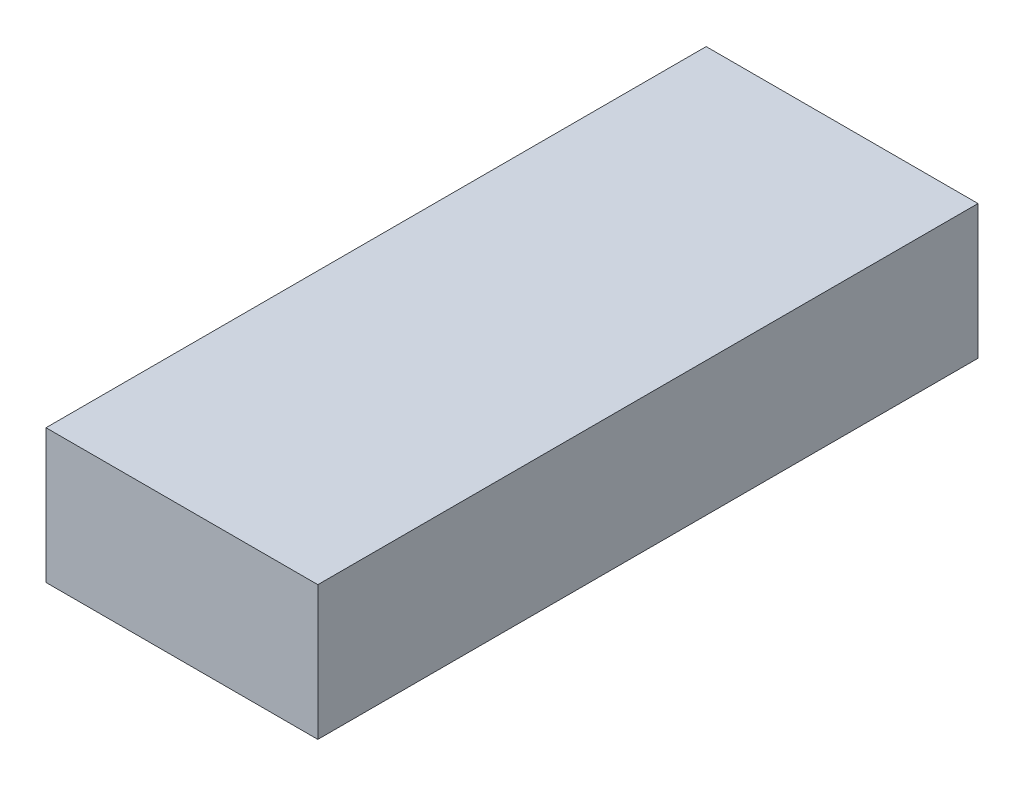
ISO-10303-21;
HEADER;
FILE_DESCRIPTION(('STEP AP214'),'2;1');
FILE_NAME('part.step','',(''),(''),'','','');
FILE_SCHEMA(('AUTOMOTIVE_DESIGN { 1 0 10303 214 1 1 1 1 }'));
ENDSEC;
DATA;
#1=APPLICATION_CONTEXT('core data for automotive mechanical design processes');
#2=APPLICATION_PROTOCOL_DEFINITION('international standard','automotive_design',2000,#1);
#3=PRODUCT_CONTEXT('',#1,'mechanical');
#4=PRODUCT('Part','Part','',(#3));
#5=PRODUCT_RELATED_PRODUCT_CATEGORY('part','',(#4));
#6=PRODUCT_DEFINITION_FORMATION('','',#4);
#7=PRODUCT_DEFINITION_CONTEXT('part definition',#1,'design');
#8=PRODUCT_DEFINITION('design','',#6,#7);
#9=PRODUCT_DEFINITION_SHAPE('','',#8);
#10=(LENGTH_UNIT() NAMED_UNIT(*) SI_UNIT(.MILLI.,.METRE.));
#11=(NAMED_UNIT(*) PLANE_ANGLE_UNIT() SI_UNIT($,.RADIAN.));
#12=(NAMED_UNIT(*) SI_UNIT($,.STERADIAN.) SOLID_ANGLE_UNIT());
#13=UNCERTAINTY_MEASURE_WITH_UNIT(LENGTH_MEASURE(1.E-05),#10,'distance_accuracy_value','');
#14=(GEOMETRIC_REPRESENTATION_CONTEXT(3) GLOBAL_UNCERTAINTY_ASSIGNED_CONTEXT((#13)) GLOBAL_UNIT_ASSIGNED_CONTEXT((#10,
#11,#12)) REPRESENTATION_CONTEXT('',''));
#15=CARTESIAN_POINT('',(0.,0.,0.));
#16=DIRECTION('',(0.,0.,1.));
#17=DIRECTION('',(1.,0.,0.));
#18=AXIS2_PLACEMENT_3D('',#15,#16,#17);
#19=CARTESIAN_POINT('',(-15.2,-15.4,-23.2));
#20=DIRECTION('',(0.,-1.,0.));
#21=DIRECTION('',(0.,0.,-1.));
#22=AXIS2_PLACEMENT_3D('',#19,#20,#21);
#23=PLANE('',#22);
#24=CARTESIAN_POINT('',(-15.2,-15.4,-23.2));
#25=DIRECTION('',(0.,-1.,0.));
#26=DIRECTION('',(0.,0.,-1.));
#27=AXIS2_PLACEMENT_3D('',#24,#25,#26);
#28=CIRCLE('',#27,5.);
#29=CARTESIAN_POINT('',(-19.7,-15.4,-21.0205505282297));
#30=VERTEX_POINT('',#29);
#31=CARTESIAN_POINT('',(-19.7,-15.4,-25.3794494717704));
#32=VERTEX_POINT('',#31);
#33=EDGE_CURVE('E281',#30,#32,#28,.T.);
#34=ORIENTED_EDGE('',*,*,#33,.F.);
#35=DIRECTION('',(0.,0.,-1.));
#36=VECTOR('',#35,1.);
#37=CARTESIAN_POINT('',(-19.7,-15.4,-101.2));
#38=LINE('',#37,#36);
#39=EDGE_CURVE('E439',#30,#32,#38,.T.);
#40=ORIENTED_EDGE('',*,*,#39,.T.);
#41=EDGE_LOOP('',(#34,#40));
#42=FACE_BOUND('',#41,.T.);
#43=ADVANCED_FACE('F35',(#42),#23,.F.);
#44=CARTESIAN_POINT('',(15.2,-15.4,-23.2));
#45=DIRECTION('',(0.,-1.,0.));
#46=DIRECTION('',(0.,0.,-1.));
#47=AXIS2_PLACEMENT_3D('',#44,#45,#46);
#48=PLANE('',#47);
#49=CARTESIAN_POINT('',(15.2,-15.4,-83.2));
#50=DIRECTION('',(0.,-1.,0.));
#51=DIRECTION('',(0.,0.,-1.));
#52=AXIS2_PLACEMENT_3D('',#49,#50,#51);
#53=CIRCLE('',#52,5.);
#54=CARTESIAN_POINT('',(19.7,-15.4,-85.3794494717703));
#55=VERTEX_POINT('',#54);
#56=CARTESIAN_POINT('',(19.7,-15.4,-81.0205505282297));
#57=VERTEX_POINT('',#56);
#58=EDGE_CURVE('E265',#55,#57,#53,.T.);
#59=ORIENTED_EDGE('',*,*,#58,.F.);
#60=DIRECTION('',(0.,0.,1.));
#61=VECTOR('',#60,1.);
#62=CARTESIAN_POINT('',(19.7,-15.4,2.20000000000001));
#63=LINE('',#62,#61);
#64=EDGE_CURVE('E431',#55,#57,#63,.T.);
#65=ORIENTED_EDGE('',*,*,#64,.T.);
#66=EDGE_LOOP('',(#59,#65));
#67=FACE_BOUND('',#66,.T.);
#68=ADVANCED_FACE('F496',(#67),#48,.F.);
#69=CARTESIAN_POINT('',(19.7,-134.985613127271,-101.2));
#70=DIRECTION('',(-1.,0.,0.));
#71=DIRECTION('',(0.,0.,1.));
#72=AXIS2_PLACEMENT_3D('',#69,#70,#71);
#73=PLANE('',#72);
#74=DIRECTION('',(0.,1.,0.));
#75=VECTOR('',#74,1.);
#76=CARTESIAN_POINT('',(19.7,-134.985613127271,-101.2));
#77=LINE('',#76,#75);
#78=CARTESIAN_POINT('',(19.7,-15.4,-101.2));
#79=VERTEX_POINT('',#78);
#80=CARTESIAN_POINT('',(19.7,-13.,-101.2));
#81=VERTEX_POINT('',#80);
#82=EDGE_CURVE('E239',#79,#81,#77,.T.);
#83=ORIENTED_EDGE('',*,*,#82,.F.);
#84=DIRECTION('',(0.,0.,1.));
#85=VECTOR('',#84,1.);
#86=CARTESIAN_POINT('',(19.7,-15.4,-101.2));
#87=LINE('',#86,#85);
#88=EDGE_CURVE('E250',#79,#55,#87,.T.);
#89=ORIENTED_EDGE('',*,*,#88,.T.);
#90=DIRECTION('',(0.,1.,0.));
#91=VECTOR('',#90,1.);
#92=CARTESIAN_POINT('',(19.7,-15.4,-85.3794494717703));
#93=LINE('',#92,#91);
#94=CARTESIAN_POINT('',(19.7,-13.,-85.3794494717703));
#95=VERTEX_POINT('',#94);
#96=EDGE_CURVE('E413',#55,#95,#93,.T.);
#97=ORIENTED_EDGE('',*,*,#96,.T.);
#98=DIRECTION('',(0.,0.,-1.));
#99=VECTOR('',#98,1.);
#100=CARTESIAN_POINT('',(19.7,-13.,2.20000000000001));
#101=LINE('',#100,#99);
#102=EDGE_CURVE('E346',#95,#81,#101,.T.);
#103=ORIENTED_EDGE('',*,*,#102,.T.);
#104=EDGE_LOOP('',(#83,#89,#97,#103));
#105=FACE_BOUND('',#104,.T.);
#106=ADVANCED_FACE('F453',(#105),#73,.T.);
#107=DIRECTION('',(0.,1.,0.));
#108=VECTOR('',#107,1.);
#109=CARTESIAN_POINT('',(19.7,-15.4,-81.0205505282297));
#110=LINE('',#109,#108);
#111=CARTESIAN_POINT('',(19.7,-13.,-81.0205505282297));
#112=VERTEX_POINT('',#111);
#113=EDGE_CURVE('E416',#112,#57,#110,.F.);
#114=ORIENTED_EDGE('',*,*,#113,.T.);
#115=CARTESIAN_POINT('',(19.7,-15.4,-25.3794494717703));
#116=VERTEX_POINT('',#115);
#117=EDGE_CURVE('E249',#57,#116,#87,.T.);
#118=ORIENTED_EDGE('',*,*,#117,.T.);
#119=DIRECTION('',(0.,1.,0.));
#120=VECTOR('',#119,1.);
#121=CARTESIAN_POINT('',(19.7,-15.4,-25.3794494717703));
#122=LINE('',#121,#120);
#123=CARTESIAN_POINT('',(19.7,-13.,-25.3794494717703));
#124=VERTEX_POINT('',#123);
#125=EDGE_CURVE('E419',#116,#124,#122,.T.);
#126=ORIENTED_EDGE('',*,*,#125,.T.);
#127=EDGE_CURVE('E349',#124,#112,#101,.T.);
#128=ORIENTED_EDGE('',*,*,#127,.T.);
#129=EDGE_LOOP('',(#114,#118,#126,#128));
#130=FACE_BOUND('',#129,.T.);
#131=ADVANCED_FACE('F490',(#130),#73,.T.);
#132=DIRECTION('',(0.,1.,0.));
#133=VECTOR('',#132,1.);
#134=CARTESIAN_POINT('',(19.7,-15.4,-21.0205505282297));
#135=LINE('',#134,#133);
#136=CARTESIAN_POINT('',(19.7,-13.,-21.0205505282297));
#137=VERTEX_POINT('',#136);
#138=CARTESIAN_POINT('',(19.7,-15.4,-21.0205505282297));
#139=VERTEX_POINT('',#138);
#140=EDGE_CURVE('E422',#137,#139,#135,.F.);
#141=ORIENTED_EDGE('',*,*,#140,.T.);
#142=CARTESIAN_POINT('',(19.7,-15.4,2.19999999999998));
#143=VERTEX_POINT('',#142);
#144=EDGE_CURVE('E229',#139,#143,#87,.T.);
#145=ORIENTED_EDGE('',*,*,#144,.T.);
#146=DIRECTION('',(0.,1.,0.));
#147=VECTOR('',#146,1.);
#148=CARTESIAN_POINT('',(19.7,-134.985613127271,2.20000000000001));
#149=LINE('',#148,#147);
#150=CARTESIAN_POINT('',(19.7,-13.,2.20000000000001));
#151=VERTEX_POINT('',#150);
#152=EDGE_CURVE('E300',#143,#151,#149,.T.);
#153=ORIENTED_EDGE('',*,*,#152,.T.);
#154=EDGE_CURVE('E328',#151,#137,#101,.T.);
#155=ORIENTED_EDGE('',*,*,#154,.T.);
#156=EDGE_LOOP('',(#141,#145,#153,#155));
#157=FACE_BOUND('',#156,.T.);
#158=ADVANCED_FACE('F479',(#157),#73,.T.);
#159=CARTESIAN_POINT('',(-19.7,-134.985613127271,2.20000000000001));
#160=DIRECTION('',(1.,0.,0.));
#161=DIRECTION('',(0.,0.,-1.));
#162=AXIS2_PLACEMENT_3D('',#159,#160,#161);
#163=PLANE('',#162);
#164=DIRECTION('',(0.,1.,0.));
#165=VECTOR('',#164,1.);
#166=CARTESIAN_POINT('',(-19.7,-134.985613127271,2.20000000000001));
#167=LINE('',#166,#165);
#168=CARTESIAN_POINT('',(-19.7,-15.4,2.20000000000001));
#169=VERTEX_POINT('',#168);
#170=CARTESIAN_POINT('',(-19.7,-13.,2.20000000000001));
#171=VERTEX_POINT('',#170);
#172=EDGE_CURVE('E299',#169,#171,#167,.T.);
#173=ORIENTED_EDGE('',*,*,#172,.F.);
#174=DIRECTION('',(0.,0.,-1.));
#175=VECTOR('',#174,1.);
#176=CARTESIAN_POINT('',(-19.7,-15.4,2.20000000000001));
#177=LINE('',#176,#175);
#178=EDGE_CURVE('E258',#169,#30,#177,.T.);
#179=ORIENTED_EDGE('',*,*,#178,.T.);
#180=DIRECTION('',(0.,1.,0.));
#181=VECTOR('',#180,1.);
#182=CARTESIAN_POINT('',(-19.7,-15.4,-21.0205505282297));
#183=LINE('',#182,#181);
#184=CARTESIAN_POINT('',(-19.7,-13.,-21.0205505282297));
#185=VERTEX_POINT('',#184);
#186=EDGE_CURVE('E407',#30,#185,#183,.T.);
#187=ORIENTED_EDGE('',*,*,#186,.T.);
#188=DIRECTION('',(0.,0.,1.));
#189=VECTOR('',#188,1.);
#190=CARTESIAN_POINT('',(-19.7,-13.,2.20000000000001));
#191=LINE('',#190,#189);
#192=EDGE_CURVE('E323',#185,#171,#191,.T.);
#193=ORIENTED_EDGE('',*,*,#192,.T.);
#194=EDGE_LOOP('',(#173,#179,#187,#193));
#195=FACE_BOUND('',#194,.T.);
#196=ADVANCED_FACE('F471',(#195),#163,.T.);
#197=DIRECTION('',(0.,1.,0.));
#198=VECTOR('',#197,1.);
#199=CARTESIAN_POINT('',(-19.7,-15.4,-25.3794494717704));
#200=LINE('',#199,#198);
#201=CARTESIAN_POINT('',(-19.7,-13.,-25.3794494717704));
#202=VERTEX_POINT('',#201);
#203=EDGE_CURVE('E410',#202,#32,#200,.F.);
#204=ORIENTED_EDGE('',*,*,#203,.T.);
#205=CARTESIAN_POINT('',(-19.7,-15.4,-81.0205505282297));
#206=VERTEX_POINT('',#205);
#207=EDGE_CURVE('E257',#32,#206,#177,.T.);
#208=ORIENTED_EDGE('',*,*,#207,.T.);
#209=DIRECTION('',(0.,1.,0.));
#210=VECTOR('',#209,1.);
#211=CARTESIAN_POINT('',(-19.7,-15.4,-81.0205505282297));
#212=LINE('',#211,#210);
#213=CARTESIAN_POINT('',(-19.7,-13.,-81.0205505282297));
#214=VERTEX_POINT('',#213);
#215=EDGE_CURVE('E262',#206,#214,#212,.T.);
#216=ORIENTED_EDGE('',*,*,#215,.T.);
#217=EDGE_CURVE('E343',#214,#202,#191,.T.);
#218=ORIENTED_EDGE('',*,*,#217,.T.);
#219=EDGE_LOOP('',(#204,#208,#216,#218));
#220=FACE_BOUND('',#219,.T.);
#221=ADVANCED_FACE('F531',(#220),#163,.T.);
#222=DIRECTION('',(0.,1.,0.));
#223=VECTOR('',#222,1.);
#224=CARTESIAN_POINT('',(-19.7,-15.4,-85.3794494717703));
#225=LINE('',#224,#223);
#226=CARTESIAN_POINT('',(-19.7,-13.,-85.3794494717703));
#227=VERTEX_POINT('',#226);
#228=CARTESIAN_POINT('',(-19.7,-15.4,-85.3794494717703));
#229=VERTEX_POINT('',#228);
#230=EDGE_CURVE('E277',#227,#229,#225,.F.);
#231=ORIENTED_EDGE('',*,*,#230,.T.);
#232=CARTESIAN_POINT('',(-19.7,-15.4,-101.2));
#233=VERTEX_POINT('',#232);
#234=EDGE_CURVE('E255',#229,#233,#177,.T.);
#235=ORIENTED_EDGE('',*,*,#234,.T.);
#236=DIRECTION('',(0.,1.,0.));
#237=VECTOR('',#236,1.);
#238=CARTESIAN_POINT('',(-19.7,-134.985613127271,-101.2));
#239=LINE('',#238,#237);
#240=CARTESIAN_POINT('',(-19.7,-13.,-101.2));
#241=VERTEX_POINT('',#240);
#242=EDGE_CURVE('E312',#233,#241,#239,.T.);
#243=ORIENTED_EDGE('',*,*,#242,.T.);
#244=EDGE_CURVE('E339',#241,#227,#191,.T.);
#245=ORIENTED_EDGE('',*,*,#244,.T.);
#246=EDGE_LOOP('',(#231,#235,#243,#245));
#247=FACE_BOUND('',#246,.T.);
#248=ADVANCED_FACE('F532',(#247),#163,.T.);
#249=CARTESIAN_POINT('',(0.,0.,0.));
#250=DIRECTION('',(0.,-1.,0.));
#251=DIRECTION('',(0.,0.,-1.));
#252=AXIS2_PLACEMENT_3D('',#249,#250,#251);
#253=PLANE('',#252);
#254=DIRECTION('',(-1.,0.,0.));
#255=VECTOR('',#254,1.);
#256=CARTESIAN_POINT('',(-17.7,0.,-99.2));
#257=LINE('',#256,#255);
#258=CARTESIAN_POINT('',(17.7,0.,-99.2));
#259=VERTEX_POINT('',#258);
#260=CARTESIAN_POINT('',(-17.7,0.,-99.2));
#261=VERTEX_POINT('',#260);
#262=EDGE_CURVE('E395',#259,#261,#257,.T.);
#263=ORIENTED_EDGE('',*,*,#262,.F.);
#264=DIRECTION('',(0.,0.,-1.));
#265=VECTOR('',#264,1.);
#266=CARTESIAN_POINT('',(17.7,0.,-99.2));
#267=LINE('',#266,#265);
#268=CARTESIAN_POINT('',(17.7,0.,0.200000000000006));
#269=VERTEX_POINT('',#268);
#270=EDGE_CURVE('E404',#269,#259,#267,.T.);
#271=ORIENTED_EDGE('',*,*,#270,.F.);
#272=DIRECTION('',(1.,0.,0.));
#273=VECTOR('',#272,1.);
#274=CARTESIAN_POINT('',(-17.7,0.,0.200000000000006));
#275=LINE('',#274,#273);
#276=CARTESIAN_POINT('',(-17.7,0.,0.200000000000006));
#277=VERTEX_POINT('',#276);
#278=EDGE_CURVE('E401',#277,#269,#275,.T.);
#279=ORIENTED_EDGE('',*,*,#278,.F.);
#280=DIRECTION('',(0.,0.,1.));
#281=VECTOR('',#280,1.);
#282=CARTESIAN_POINT('',(-17.7,0.,-99.2));
#283=LINE('',#282,#281);
#284=EDGE_CURVE('E398',#261,#277,#283,.T.);
#285=ORIENTED_EDGE('',*,*,#284,.F.);
#286=EDGE_LOOP('',(#263,#271,#279,#285));
#287=FACE_BOUND('',#286,.T.);
#288=DIRECTION('',(0.,0.,-1.));
#289=VECTOR('',#288,1.);
#290=CARTESIAN_POINT('',(16.5,0.,-98.));
#291=LINE('',#290,#289);
#292=CARTESIAN_POINT('',(16.5,0.,-1.));
#293=VERTEX_POINT('',#292);
#294=CARTESIAN_POINT('',(16.5,0.,-98.));
#295=VERTEX_POINT('',#294);
#296=EDGE_CURVE('E366',#293,#295,#291,.T.);
#297=ORIENTED_EDGE('',*,*,#296,.T.);
#298=DIRECTION('',(-1.,0.,0.));
#299=VECTOR('',#298,1.);
#300=CARTESIAN_POINT('',(-16.5,0.,-98.));
#301=LINE('',#300,#299);
#302=CARTESIAN_POINT('',(-16.5,0.,-98.));
#303=VERTEX_POINT('',#302);
#304=EDGE_CURVE('E338',#295,#303,#301,.T.);
#305=ORIENTED_EDGE('',*,*,#304,.T.);
#306=DIRECTION('',(0.,0.,1.));
#307=VECTOR('',#306,1.);
#308=CARTESIAN_POINT('',(-16.5,0.,-98.));
#309=LINE('',#308,#307);
#310=CARTESIAN_POINT('',(-16.5,0.,-1.));
#311=VERTEX_POINT('',#310);
#312=EDGE_CURVE('E378',#303,#311,#309,.T.);
#313=ORIENTED_EDGE('',*,*,#312,.T.);
#314=DIRECTION('',(1.,0.,0.));
#315=VECTOR('',#314,1.);
#316=CARTESIAN_POINT('',(-16.5,0.,-1.));
#317=LINE('',#316,#315);
#318=EDGE_CURVE('E381',#311,#293,#317,.T.);
#319=ORIENTED_EDGE('',*,*,#318,.T.);
#320=EDGE_LOOP('',(#297,#305,#313,#319));
#321=FACE_BOUND('',#320,.T.);
#322=ADVANCED_FACE('F592',(#287,#321),#253,.T.);
#323=CARTESIAN_POINT('',(-16.5,2.4,-98.));
#324=DIRECTION('',(0.,0.,1.));
#325=DIRECTION('',(1.,0.,0.));
#326=AXIS2_PLACEMENT_3D('',#323,#324,#325);
#327=PLANE('',#326);
#328=ORIENTED_EDGE('',*,*,#304,.F.);
#329=DIRECTION('',(0.,-1.,0.));
#330=VECTOR('',#329,1.);
#331=CARTESIAN_POINT('',(16.5,2.4,-98.));
#332=LINE('',#331,#330);
#333=CARTESIAN_POINT('',(16.5,2.4,-98.));
#334=VERTEX_POINT('',#333);
#335=EDGE_CURVE('E375',#334,#295,#332,.T.);
#336=ORIENTED_EDGE('',*,*,#335,.F.);
#337=DIRECTION('',(-1.,0.,0.));
#338=VECTOR('',#337,1.);
#339=CARTESIAN_POINT('',(-16.5,2.4,-98.));
#340=LINE('',#339,#338);
#341=CARTESIAN_POINT('',(-16.5,2.4,-98.));
#342=VERTEX_POINT('',#341);
#343=EDGE_CURVE('E362',#334,#342,#340,.T.);
#344=ORIENTED_EDGE('',*,*,#343,.T.);
#345=DIRECTION('',(0.,-1.,0.));
#346=VECTOR('',#345,1.);
#347=CARTESIAN_POINT('',(-16.5,2.4,-98.));
#348=LINE('',#347,#346);
#349=EDGE_CURVE('E392',#342,#303,#348,.T.);
#350=ORIENTED_EDGE('',*,*,#349,.T.);
#351=EDGE_LOOP('',(#328,#336,#344,#350));
#352=FACE_BOUND('',#351,.T.);
#353=ADVANCED_FACE('F588',(#352),#327,.T.);
#354=CARTESIAN_POINT('',(-16.5,2.4,-98.));
#355=DIRECTION('',(1.,0.,0.));
#356=DIRECTION('',(0.,0.,-1.));
#357=AXIS2_PLACEMENT_3D('',#354,#355,#356);
#358=PLANE('',#357);
#359=ORIENTED_EDGE('',*,*,#312,.F.);
#360=ORIENTED_EDGE('',*,*,#349,.F.);
#361=DIRECTION('',(0.,0.,1.));
#362=VECTOR('',#361,1.);
#363=CARTESIAN_POINT('',(-16.5,2.4,-98.));
#364=LINE('',#363,#362);
#365=CARTESIAN_POINT('',(-16.5,2.4,-1.));
#366=VERTEX_POINT('',#365);
#367=EDGE_CURVE('E365',#342,#366,#364,.T.);
#368=ORIENTED_EDGE('',*,*,#367,.T.);
#369=DIRECTION('',(0.,-1.,0.));
#370=VECTOR('',#369,1.);
#371=CARTESIAN_POINT('',(-16.5,2.4,-1.));
#372=LINE('',#371,#370);
#373=EDGE_CURVE('E390',#366,#311,#372,.T.);
#374=ORIENTED_EDGE('',*,*,#373,.T.);
#375=EDGE_LOOP('',(#359,#360,#368,#374));
#376=FACE_BOUND('',#375,.T.);
#377=ADVANCED_FACE('F584',(#376),#358,.T.);
#378=CARTESIAN_POINT('',(-16.5,2.4,-1.));
#379=DIRECTION('',(0.,0.,-1.));
#380=DIRECTION('',(-1.,0.,0.));
#381=AXIS2_PLACEMENT_3D('',#378,#379,#380);
#382=PLANE('',#381);
#383=ORIENTED_EDGE('',*,*,#318,.F.);
#384=ORIENTED_EDGE('',*,*,#373,.F.);
#385=DIRECTION('',(1.,0.,0.));
#386=VECTOR('',#385,1.);
#387=CARTESIAN_POINT('',(-16.5,2.4,-1.));
#388=LINE('',#387,#386);
#389=CARTESIAN_POINT('',(16.5,2.4,-1.));
#390=VERTEX_POINT('',#389);
#391=EDGE_CURVE('E369',#366,#390,#388,.T.);
#392=ORIENTED_EDGE('',*,*,#391,.T.);
#393=DIRECTION('',(0.,-1.,0.));
#394=VECTOR('',#393,1.);
#395=CARTESIAN_POINT('',(16.5,2.4,-1.));
#396=LINE('',#395,#394);
#397=EDGE_CURVE('E388',#390,#293,#396,.T.);
#398=ORIENTED_EDGE('',*,*,#397,.T.);
#399=EDGE_LOOP('',(#383,#384,#392,#398));
#400=FACE_BOUND('',#399,.T.);
#401=ADVANCED_FACE('F580',(#400),#382,.T.);
#402=CARTESIAN_POINT('',(16.5,2.4,-98.));
#403=DIRECTION('',(-1.,0.,0.));
#404=DIRECTION('',(0.,0.,1.));
#405=AXIS2_PLACEMENT_3D('',#402,#403,#404);
#406=PLANE('',#405);
#407=ORIENTED_EDGE('',*,*,#296,.F.);
#408=ORIENTED_EDGE('',*,*,#397,.F.);
#409=DIRECTION('',(0.,0.,-1.));
#410=VECTOR('',#409,1.);
#411=CARTESIAN_POINT('',(16.5,2.4,-98.));
#412=LINE('',#411,#410);
#413=EDGE_CURVE('E372',#390,#334,#412,.T.);
#414=ORIENTED_EDGE('',*,*,#413,.T.);
#415=ORIENTED_EDGE('',*,*,#335,.T.);
#416=EDGE_LOOP('',(#407,#408,#414,#415));
#417=FACE_BOUND('',#416,.T.);
#418=ADVANCED_FACE('F560',(#417),#406,.T.);
#419=CARTESIAN_POINT('',(-19.7,-136.652248056693,-101.2));
#420=DIRECTION('',(0.,0.,-1.));
#421=DIRECTION('',(-1.,0.,0.));
#422=AXIS2_PLACEMENT_3D('',#419,#420,#421);
#423=PLANE('',#422);
#424=DIRECTION('',(0.,-1.,0.));
#425=VECTOR('',#424,1.);
#426=CARTESIAN_POINT('',(17.7,90.0758740186589,-101.2));
#427=LINE('',#426,#425);
#428=CARTESIAN_POINT('',(17.7,-15.8,-101.2));
#429=VERTEX_POINT('',#428);
#430=CARTESIAN_POINT('',(17.7,-17.,-101.2));
#431=VERTEX_POINT('',#430);
#432=EDGE_CURVE('E219',#429,#431,#427,.T.);
#433=ORIENTED_EDGE('',*,*,#432,.F.);
#434=DIRECTION('',(0.980580675690921,0.196116135138179,0.));
#435=VECTOR('',#434,1.);
#436=CARTESIAN_POINT('',(-41.5023553955175,-27.6404710791032,-101.2));
#437=LINE('',#436,#435);
#438=EDGE_CURVE('E435',#429,#79,#437,.T.);
#439=ORIENTED_EDGE('',*,*,#438,.T.);
#440=ORIENTED_EDGE('',*,*,#82,.T.);
#441=DIRECTION('',(-1.,0.,0.));
#442=VECTOR('',#441,1.);
#443=CARTESIAN_POINT('',(-19.7,-13.,-101.2));
#444=LINE('',#443,#442);
#445=EDGE_CURVE('E342',#81,#241,#444,.T.);
#446=ORIENTED_EDGE('',*,*,#445,.T.);
#447=ORIENTED_EDGE('',*,*,#242,.F.);
#448=DIRECTION('',(0.980580675690921,-0.196116135138178,0.));
#449=VECTOR('',#448,1.);
#450=CARTESIAN_POINT('',(3.61774001090188,-20.0635480021802,-101.2));
#451=LINE('',#450,#449);
#452=CARTESIAN_POINT('',(-17.7,-15.8,-101.2));
#453=VERTEX_POINT('',#452);
#454=EDGE_CURVE('E58',#233,#453,#451,.T.);
#455=ORIENTED_EDGE('',*,*,#454,.T.);
#456=DIRECTION('',(0.,-1.,0.));
#457=VECTOR('',#456,1.);
#458=CARTESIAN_POINT('',(-17.7,90.0758740186589,-101.2));
#459=LINE('',#458,#457);
#460=CARTESIAN_POINT('',(-17.7,-17.,-101.2));
#461=VERTEX_POINT('',#460);
#462=EDGE_CURVE('E253',#453,#461,#459,.T.);
#463=ORIENTED_EDGE('',*,*,#462,.T.);
#464=DIRECTION('',(-1.,0.,0.));
#465=VECTOR('',#464,1.);
#466=CARTESIAN_POINT('',(-21.7,-17.,-101.2));
#467=LINE('',#466,#465);
#468=CARTESIAN_POINT('',(-21.7,-17.,-101.2));
#469=VERTEX_POINT('',#468);
#470=EDGE_CURVE('E290',#461,#469,#467,.T.);
#471=ORIENTED_EDGE('',*,*,#470,.T.);
#472=DIRECTION('',(0.,1.,0.));
#473=VECTOR('',#472,1.);
#474=CARTESIAN_POINT('',(-21.7,-134.985613127271,-101.2));
#475=LINE('',#474,#473);
#476=CARTESIAN_POINT('',(-21.7,4.4,-101.2));
#477=VERTEX_POINT('',#476);
#478=EDGE_CURVE('E298',#469,#477,#475,.T.);
#479=ORIENTED_EDGE('',*,*,#478,.T.);
#480=DIRECTION('',(-1.,0.,0.));
#481=VECTOR('',#480,1.);
#482=CARTESIAN_POINT('',(-19.7,4.4,-101.2));
#483=LINE('',#482,#481);
#484=CARTESIAN_POINT('',(21.7,4.4,-101.2));
#485=VERTEX_POINT('',#484);
#486=EDGE_CURVE('E320',#485,#477,#483,.T.);
#487=ORIENTED_EDGE('',*,*,#486,.F.);
#488=DIRECTION('',(0.,1.,0.));
#489=VECTOR('',#488,1.);
#490=CARTESIAN_POINT('',(21.7,-134.985613127271,-101.2));
#491=LINE('',#490,#489);
#492=CARTESIAN_POINT('',(21.7,-17.,-101.2));
#493=VERTEX_POINT('',#492);
#494=EDGE_CURVE('E235',#493,#485,#491,.T.);
#495=ORIENTED_EDGE('',*,*,#494,.F.);
#496=DIRECTION('',(-1.,0.,0.));
#497=VECTOR('',#496,1.);
#498=CARTESIAN_POINT('',(19.7,-17.,-101.2));
#499=LINE('',#498,#497);
#500=EDGE_CURVE('E232',#493,#431,#499,.T.);
#501=ORIENTED_EDGE('',*,*,#500,.T.);
#502=EDGE_LOOP('',(#433,#439,#440,#446,#447,#455,#463,#471,#479,#487,#495,#501));
#503=FACE_BOUND('',#502,.T.);
#504=ADVANCED_FACE('F233',(#503),#423,.T.);
#505=CARTESIAN_POINT('',(-17.7,-136.652248056693,0.200000000000006));
#506=DIRECTION('',(-1.,0.,0.));
#507=DIRECTION('',(0.,0.,1.));
#508=AXIS2_PLACEMENT_3D('',#505,#506,#507);
#509=PLANE('',#508);
#510=ORIENTED_EDGE('',*,*,#284,.T.);
#511=DIRECTION('',(0.,1.,0.));
#512=VECTOR('',#511,1.);
#513=CARTESIAN_POINT('',(-17.7,-136.652248056693,0.200000000000006));
#514=LINE('',#513,#512);
#515=CARTESIAN_POINT('',(-17.7,-13.,0.200000000000006));
#516=VERTEX_POINT('',#515);
#517=EDGE_CURVE('E335',#516,#277,#514,.T.);
#518=ORIENTED_EDGE('',*,*,#517,.F.);
#519=DIRECTION('',(0.,0.,1.));
#520=VECTOR('',#519,1.);
#521=CARTESIAN_POINT('',(-17.7,-13.,0.200000000000006));
#522=LINE('',#521,#520);
#523=CARTESIAN_POINT('',(-17.7,-13.,-99.2));
#524=VERTEX_POINT('',#523);
#525=EDGE_CURVE('E329',#524,#516,#522,.T.);
#526=ORIENTED_EDGE('',*,*,#525,.F.);
#527=DIRECTION('',(0.,1.,0.));
#528=VECTOR('',#527,1.);
#529=CARTESIAN_POINT('',(-17.7,-136.652248056693,-99.2));
#530=LINE('',#529,#528);
#531=EDGE_CURVE('E327',#524,#261,#530,.T.);
#532=ORIENTED_EDGE('',*,*,#531,.T.);
#533=EDGE_LOOP('',(#510,#518,#526,#532));
#534=FACE_BOUND('',#533,.T.);
#535=ADVANCED_FACE('F559',(#534),#509,.F.);
#536=CARTESIAN_POINT('',(-17.7,-136.652248056693,-99.2));
#537=DIRECTION('',(0.,0.,-1.));
#538=DIRECTION('',(-1.,0.,0.));
#539=AXIS2_PLACEMENT_3D('',#536,#537,#538);
#540=PLANE('',#539);
#541=ORIENTED_EDGE('',*,*,#262,.T.);
#542=ORIENTED_EDGE('',*,*,#531,.F.);
#543=DIRECTION('',(-1.,0.,0.));
#544=VECTOR('',#543,1.);
#545=CARTESIAN_POINT('',(-17.7,-13.,-99.2));
#546=LINE('',#545,#544);
#547=CARTESIAN_POINT('',(17.7,-13.,-99.2));
#548=VERTEX_POINT('',#547);
#549=EDGE_CURVE('E332',#548,#524,#546,.T.);
#550=ORIENTED_EDGE('',*,*,#549,.F.);
#551=DIRECTION('',(0.,1.,0.));
#552=VECTOR('',#551,1.);
#553=CARTESIAN_POINT('',(17.7,-136.652248056693,-99.2));
#554=LINE('',#553,#552);
#555=EDGE_CURVE('E354',#548,#259,#554,.T.);
#556=ORIENTED_EDGE('',*,*,#555,.T.);
#557=EDGE_LOOP('',(#541,#542,#550,#556));
#558=FACE_BOUND('',#557,.T.);
#559=ADVANCED_FACE('F568',(#558),#540,.F.);
#560=CARTESIAN_POINT('',(17.7,-136.652248056693,0.200000000000006));
#561=DIRECTION('',(1.,0.,0.));
#562=DIRECTION('',(0.,0.,-1.));
#563=AXIS2_PLACEMENT_3D('',#560,#561,#562);
#564=PLANE('',#563);
#565=ORIENTED_EDGE('',*,*,#270,.T.);
#566=ORIENTED_EDGE('',*,*,#555,.F.);
#567=DIRECTION('',(0.,0.,-1.));
#568=VECTOR('',#567,1.);
#569=CARTESIAN_POINT('',(17.7,-13.,0.200000000000006));
#570=LINE('',#569,#568);
#571=CARTESIAN_POINT('',(17.7,-13.,0.200000000000006));
#572=VERTEX_POINT('',#571);
#573=EDGE_CURVE('E336',#572,#548,#570,.T.);
#574=ORIENTED_EDGE('',*,*,#573,.F.);
#575=DIRECTION('',(0.,1.,0.));
#576=VECTOR('',#575,1.);
#577=CARTESIAN_POINT('',(17.7,-136.652248056693,0.200000000000006));
#578=LINE('',#577,#576);
#579=EDGE_CURVE('E357',#572,#269,#578,.T.);
#580=ORIENTED_EDGE('',*,*,#579,.T.);
#581=EDGE_LOOP('',(#565,#566,#574,#580));
#582=FACE_BOUND('',#581,.T.);
#583=ADVANCED_FACE('F564',(#582),#564,.F.);
#584=CARTESIAN_POINT('',(-17.7,-136.652248056693,0.200000000000006));
#585=DIRECTION('',(0.,0.,1.));
#586=DIRECTION('',(1.,0.,0.));
#587=AXIS2_PLACEMENT_3D('',#584,#585,#586);
#588=PLANE('',#587);
#589=ORIENTED_EDGE('',*,*,#278,.T.);
#590=ORIENTED_EDGE('',*,*,#579,.F.);
#591=DIRECTION('',(1.,0.,0.));
#592=VECTOR('',#591,1.);
#593=CARTESIAN_POINT('',(-17.7,-13.,0.200000000000006));
#594=LINE('',#593,#592);
#595=EDGE_CURVE('E331',#516,#572,#594,.T.);
#596=ORIENTED_EDGE('',*,*,#595,.F.);
#597=ORIENTED_EDGE('',*,*,#517,.T.);
#598=EDGE_LOOP('',(#589,#590,#596,#597));
#599=FACE_BOUND('',#598,.T.);
#600=ADVANCED_FACE('F561',(#599),#588,.F.);
#601=CARTESIAN_POINT('',(0.,-13.,0.));
#602=DIRECTION('',(0.,-1.,0.));
#603=DIRECTION('',(0.,0.,-1.));
#604=AXIS2_PLACEMENT_3D('',#601,#602,#603);
#605=PLANE('',#604);
#606=CARTESIAN_POINT('',(15.2,-13.,-23.2));
#607=DIRECTION('',(0.,-1.,0.));
#608=DIRECTION('',(0.,0.,-1.));
#609=AXIS2_PLACEMENT_3D('',#606,#607,#608);
#610=CIRCLE('',#609,5.);
#611=EDGE_CURVE('E263',#124,#137,#610,.T.);
#612=ORIENTED_EDGE('',*,*,#611,.T.);
#613=ORIENTED_EDGE('',*,*,#154,.F.);
#614=DIRECTION('',(1.,0.,0.));
#615=VECTOR('',#614,1.);
#616=CARTESIAN_POINT('',(-19.7,-13.,2.20000000000001));
#617=LINE('',#616,#615);
#618=EDGE_CURVE('E324',#171,#151,#617,.T.);
#619=ORIENTED_EDGE('',*,*,#618,.F.);
#620=ORIENTED_EDGE('',*,*,#192,.F.);
#621=CARTESIAN_POINT('',(-15.2,-13.,-23.2));
#622=DIRECTION('',(0.,-1.,0.));
#623=DIRECTION('',(0.,0.,-1.));
#624=AXIS2_PLACEMENT_3D('',#621,#622,#623);
#625=CIRCLE('',#624,5.);
#626=EDGE_CURVE('E280',#185,#202,#625,.T.);
#627=ORIENTED_EDGE('',*,*,#626,.T.);
#628=ORIENTED_EDGE('',*,*,#217,.F.);
#629=CARTESIAN_POINT('',(-15.2,-13.,-83.2));
#630=DIRECTION('',(0.,-1.,0.));
#631=DIRECTION('',(0.,0.,-1.));
#632=AXIS2_PLACEMENT_3D('',#629,#630,#631);
#633=CIRCLE('',#632,5.00000000000001);
#634=EDGE_CURVE('E273',#214,#227,#633,.T.);
#635=ORIENTED_EDGE('',*,*,#634,.T.);
#636=ORIENTED_EDGE('',*,*,#244,.F.);
#637=ORIENTED_EDGE('',*,*,#445,.F.);
#638=ORIENTED_EDGE('',*,*,#102,.F.);
#639=CARTESIAN_POINT('',(15.2,-13.,-83.2));
#640=DIRECTION('',(0.,-1.,0.));
#641=DIRECTION('',(0.,0.,-1.));
#642=AXIS2_PLACEMENT_3D('',#639,#640,#641);
#643=CIRCLE('',#642,5.);
#644=EDGE_CURVE('E268',#95,#112,#643,.T.);
#645=ORIENTED_EDGE('',*,*,#644,.T.);
#646=ORIENTED_EDGE('',*,*,#127,.F.);
#647=EDGE_LOOP('',(#612,#613,#619,#620,#627,#628,#635,#636,#637,#638,#645,#646));
#648=FACE_BOUND('',#647,.T.);
#649=ORIENTED_EDGE('',*,*,#573,.T.);
#650=ORIENTED_EDGE('',*,*,#549,.T.);
#651=ORIENTED_EDGE('',*,*,#525,.T.);
#652=ORIENTED_EDGE('',*,*,#595,.T.);
#653=EDGE_LOOP('',(#649,#650,#651,#652));
#654=FACE_BOUND('',#653,.T.);
#655=ADVANCED_FACE('F459',(#648,#654),#605,.T.);
#656=CARTESIAN_POINT('',(0.,4.4,0.));
#657=DIRECTION('',(0.,-1.,0.));
#658=DIRECTION('',(0.,0.,-1.));
#659=AXIS2_PLACEMENT_3D('',#656,#657,#658);
#660=PLANE('',#659);
#661=DIRECTION('',(0.,0.,-1.));
#662=VECTOR('',#661,1.);
#663=CARTESIAN_POINT('',(21.7,4.4,-101.2));
#664=LINE('',#663,#662);
#665=CARTESIAN_POINT('',(21.7,4.4,4.20000000000001));
#666=VERTEX_POINT('',#665);
#667=EDGE_CURVE('E287',#666,#485,#664,.T.);
#668=ORIENTED_EDGE('',*,*,#667,.T.);
#669=ORIENTED_EDGE('',*,*,#486,.T.);
#670=DIRECTION('',(0.,0.,1.));
#671=VECTOR('',#670,1.);
#672=CARTESIAN_POINT('',(-21.7,4.4,4.20000000000001));
#673=LINE('',#672,#671);
#674=CARTESIAN_POINT('',(-21.7,4.4,4.20000000000001));
#675=VERTEX_POINT('',#674);
#676=EDGE_CURVE('E284',#477,#675,#673,.T.);
#677=ORIENTED_EDGE('',*,*,#676,.T.);
#678=DIRECTION('',(1.,0.,0.));
#679=VECTOR('',#678,1.);
#680=CARTESIAN_POINT('',(21.7,4.4,4.20000000000001));
#681=LINE('',#680,#679);
#682=EDGE_CURVE('E291',#675,#666,#681,.T.);
#683=ORIENTED_EDGE('',*,*,#682,.T.);
#684=EDGE_LOOP('',(#668,#669,#677,#683));
#685=FACE_BOUND('',#684,.T.);
#686=ADVANCED_FACE('F550',(#685),#660,.F.);
#687=CARTESIAN_POINT('',(0.,2.4,0.));
#688=DIRECTION('',(0.,-1.,0.));
#689=DIRECTION('',(0.,0.,-1.));
#690=AXIS2_PLACEMENT_3D('',#687,#688,#689);
#691=PLANE('',#690);
#692=ORIENTED_EDGE('',*,*,#367,.F.);
#693=ORIENTED_EDGE('',*,*,#343,.F.);
#694=ORIENTED_EDGE('',*,*,#413,.F.);
#695=ORIENTED_EDGE('',*,*,#391,.F.);
#696=EDGE_LOOP('',(#692,#693,#694,#695));
#697=FACE_BOUND('',#696,.T.);
#698=ADVANCED_FACE('F549',(#697),#691,.T.);
#699=CARTESIAN_POINT('',(0.,-17.,0.));
#700=DIRECTION('',(0.,-1.,0.));
#701=DIRECTION('',(0.,0.,-1.));
#702=AXIS2_PLACEMENT_3D('',#699,#700,#701);
#703=PLANE('',#702);
#704=DIRECTION('',(-1.,0.,0.));
#705=VECTOR('',#704,1.);
#706=CARTESIAN_POINT('',(19.7,-17.,2.20000000000001));
#707=LINE('',#706,#705);
#708=CARTESIAN_POINT('',(17.7,-17.,2.20000000000001));
#709=VERTEX_POINT('',#708);
#710=CARTESIAN_POINT('',(-17.7,-17.,2.20000000000001));
#711=VERTEX_POINT('',#710);
#712=EDGE_CURVE('E245',#709,#711,#707,.T.);
#713=ORIENTED_EDGE('',*,*,#712,.F.);
#714=DIRECTION('',(0.,0.,-1.));
#715=VECTOR('',#714,1.);
#716=CARTESIAN_POINT('',(17.7,-17.,4.20000000000001));
#717=LINE('',#716,#715);
#718=EDGE_CURVE('E224',#709,#431,#717,.T.);
#719=ORIENTED_EDGE('',*,*,#718,.T.);
#720=ORIENTED_EDGE('',*,*,#500,.F.);
#721=DIRECTION('',(0.,0.,-1.));
#722=VECTOR('',#721,1.);
#723=CARTESIAN_POINT('',(21.7,-17.,-101.2));
#724=LINE('',#723,#722);
#725=CARTESIAN_POINT('',(21.7,-17.,4.20000000000001));
#726=VERTEX_POINT('',#725);
#727=EDGE_CURVE('E302',#726,#493,#724,.T.);
#728=ORIENTED_EDGE('',*,*,#727,.F.);
#729=DIRECTION('',(1.,0.,0.));
#730=VECTOR('',#729,1.);
#731=CARTESIAN_POINT('',(21.7,-17.,4.20000000000001));
#732=LINE('',#731,#730);
#733=CARTESIAN_POINT('',(-21.7,-17.,4.20000000000001));
#734=VERTEX_POINT('',#733);
#735=EDGE_CURVE('E305',#734,#726,#732,.T.);
#736=ORIENTED_EDGE('',*,*,#735,.F.);
#737=DIRECTION('',(0.,0.,1.));
#738=VECTOR('',#737,1.);
#739=CARTESIAN_POINT('',(-21.7,-17.,4.20000000000001));
#740=LINE('',#739,#738);
#741=EDGE_CURVE('E308',#469,#734,#740,.T.);
#742=ORIENTED_EDGE('',*,*,#741,.F.);
#743=ORIENTED_EDGE('',*,*,#470,.F.);
#744=DIRECTION('',(0.,0.,1.));
#745=VECTOR('',#744,1.);
#746=CARTESIAN_POINT('',(-17.7,-17.,4.20000000000001));
#747=LINE('',#746,#745);
#748=EDGE_CURVE('E251',#461,#711,#747,.T.);
#749=ORIENTED_EDGE('',*,*,#748,.T.);
#750=EDGE_LOOP('',(#713,#719,#720,#728,#736,#742,#743,#749));
#751=FACE_BOUND('',#750,.T.);
#752=ADVANCED_FACE('F242',(#751),#703,.T.);
#753=CARTESIAN_POINT('',(-21.7,-134.985613127271,4.20000000000001));
#754=DIRECTION('',(-1.,0.,0.));
#755=DIRECTION('',(0.,0.,1.));
#756=AXIS2_PLACEMENT_3D('',#753,#754,#755);
#757=PLANE('',#756);
#758=DIRECTION('',(0.,1.,0.));
#759=VECTOR('',#758,1.);
#760=CARTESIAN_POINT('',(-21.7,-134.985613127271,4.20000000000001));
#761=LINE('',#760,#759);
#762=EDGE_CURVE('E307',#734,#675,#761,.T.);
#763=ORIENTED_EDGE('',*,*,#762,.T.);
#764=ORIENTED_EDGE('',*,*,#676,.F.);
#765=ORIENTED_EDGE('',*,*,#478,.F.);
#766=ORIENTED_EDGE('',*,*,#741,.T.);
#767=EDGE_LOOP('',(#763,#764,#765,#766));
#768=FACE_BOUND('',#767,.T.);
#769=ADVANCED_FACE('F542',(#768),#757,.T.);
#770=CARTESIAN_POINT('',(21.7,-134.985613127271,4.20000000000001));
#771=DIRECTION('',(0.,0.,1.));
#772=DIRECTION('',(1.,0.,0.));
#773=AXIS2_PLACEMENT_3D('',#770,#771,#772);
#774=PLANE('',#773);
#775=ORIENTED_EDGE('',*,*,#735,.T.);
#776=DIRECTION('',(0.,1.,0.));
#777=VECTOR('',#776,1.);
#778=CARTESIAN_POINT('',(21.7,-134.985613127271,4.20000000000001));
#779=LINE('',#778,#777);
#780=EDGE_CURVE('E304',#726,#666,#779,.T.);
#781=ORIENTED_EDGE('',*,*,#780,.T.);
#782=ORIENTED_EDGE('',*,*,#682,.F.);
#783=ORIENTED_EDGE('',*,*,#762,.F.);
#784=EDGE_LOOP('',(#775,#781,#782,#783));
#785=FACE_BOUND('',#784,.T.);
#786=ADVANCED_FACE('F538',(#785),#774,.T.);
#787=CARTESIAN_POINT('',(21.7,-134.985613127271,-101.2));
#788=DIRECTION('',(1.,0.,0.));
#789=DIRECTION('',(0.,0.,-1.));
#790=AXIS2_PLACEMENT_3D('',#787,#788,#789);
#791=PLANE('',#790);
#792=ORIENTED_EDGE('',*,*,#494,.T.);
#793=ORIENTED_EDGE('',*,*,#667,.F.);
#794=ORIENTED_EDGE('',*,*,#780,.F.);
#795=ORIENTED_EDGE('',*,*,#727,.T.);
#796=EDGE_LOOP('',(#792,#793,#794,#795));
#797=FACE_BOUND('',#796,.T.);
#798=ADVANCED_FACE('F534',(#797),#791,.T.);
#799=CARTESIAN_POINT('',(19.7,-134.985613127271,2.20000000000001));
#800=DIRECTION('',(0.,0.,-1.));
#801=DIRECTION('',(-1.,0.,0.));
#802=AXIS2_PLACEMENT_3D('',#799,#800,#801);
#803=PLANE('',#802);
#804=DIRECTION('',(0.,1.,0.));
#805=VECTOR('',#804,1.);
#806=CARTESIAN_POINT('',(17.7,-134.985613127271,2.20000000000001));
#807=LINE('',#806,#805);
#808=CARTESIAN_POINT('',(17.7,-15.8,2.20000000000001));
#809=VERTEX_POINT('',#808);
#810=EDGE_CURVE('E427',#709,#809,#807,.T.);
#811=ORIENTED_EDGE('',*,*,#810,.F.);
#812=ORIENTED_EDGE('',*,*,#712,.T.);
#813=DIRECTION('',(0.,-1.,0.));
#814=VECTOR('',#813,1.);
#815=CARTESIAN_POINT('',(-17.7,-134.985613127271,2.20000000000001));
#816=LINE('',#815,#814);
#817=CARTESIAN_POINT('',(-17.7,-15.8,2.20000000000001));
#818=VERTEX_POINT('',#817);
#819=EDGE_CURVE('E425',#818,#711,#816,.T.);
#820=ORIENTED_EDGE('',*,*,#819,.F.);
#821=DIRECTION('',(-0.980580675690921,0.196116135138178,0.));
#822=VECTOR('',#821,1.);
#823=CARTESIAN_POINT('',(-19.7,-15.4,2.20000000000001));
#824=LINE('',#823,#822);
#825=EDGE_CURVE('E12',#818,#169,#824,.T.);
#826=ORIENTED_EDGE('',*,*,#825,.T.);
#827=ORIENTED_EDGE('',*,*,#172,.T.);
#828=ORIENTED_EDGE('',*,*,#618,.T.);
#829=ORIENTED_EDGE('',*,*,#152,.F.);
#830=DIRECTION('',(-0.980580675690921,-0.196116135138179,0.));
#831=VECTOR('',#830,1.);
#832=CARTESIAN_POINT('',(19.7,-15.4,2.20000000000001));
#833=LINE('',#832,#831);
#834=EDGE_CURVE('E43',#143,#809,#833,.T.);
#835=ORIENTED_EDGE('',*,*,#834,.T.);
#836=EDGE_LOOP('',(#811,#812,#820,#826,#827,#828,#829,#835));
#837=FACE_BOUND('',#836,.T.);
#838=ADVANCED_FACE('F444',(#837),#803,.T.);
#839=CARTESIAN_POINT('',(-15.2,-15.4,-23.2));
#840=DIRECTION('',(0.,1.,0.));
#841=DIRECTION('',(0.,0.,1.));
#842=AXIS2_PLACEMENT_3D('',#839,#840,#841);
#843=CYLINDRICAL_SURFACE('',#842,5.);
#844=ORIENTED_EDGE('',*,*,#626,.F.);
#845=ORIENTED_EDGE('',*,*,#186,.F.);
#846=ORIENTED_EDGE('',*,*,#33,.T.);
#847=ORIENTED_EDGE('',*,*,#203,.F.);
#848=EDGE_LOOP('',(#844,#845,#846,#847));
#849=FACE_BOUND('',#848,.T.);
#850=ADVANCED_FACE('F524',(#849),#843,.F.);
#851=CARTESIAN_POINT('',(-15.2,-15.4,-83.2));
#852=DIRECTION('',(0.,-1.,0.));
#853=DIRECTION('',(0.,0.,-1.));
#854=AXIS2_PLACEMENT_3D('',#851,#852,#853);
#855=CIRCLE('',#854,5.00000000000001);
#856=EDGE_CURVE('E270',#206,#229,#855,.T.);
#857=ORIENTED_EDGE('',*,*,#856,.F.);
#858=DIRECTION('',(0.,0.,-1.));
#859=VECTOR('',#858,1.);
#860=CARTESIAN_POINT('',(-19.7,-15.4,-101.2));
#861=LINE('',#860,#859);
#862=EDGE_CURVE('E437',#206,#229,#861,.T.);
#863=ORIENTED_EDGE('',*,*,#862,.T.);
#864=EDGE_LOOP('',(#857,#863));
#865=FACE_BOUND('',#864,.T.);
#866=ADVANCED_FACE('F506',(#865),#23,.F.);
#867=CARTESIAN_POINT('',(15.2,-15.4,-83.2));
#868=DIRECTION('',(0.,1.,0.));
#869=DIRECTION('',(0.,0.,1.));
#870=AXIS2_PLACEMENT_3D('',#867,#868,#869);
#871=CYLINDRICAL_SURFACE('',#870,5.);
#872=ORIENTED_EDGE('',*,*,#644,.F.);
#873=ORIENTED_EDGE('',*,*,#96,.F.);
#874=ORIENTED_EDGE('',*,*,#58,.T.);
#875=ORIENTED_EDGE('',*,*,#113,.F.);
#876=EDGE_LOOP('',(#872,#873,#874,#875));
#877=FACE_BOUND('',#876,.T.);
#878=ADVANCED_FACE('F493',(#877),#871,.F.);
#879=CARTESIAN_POINT('',(15.2,-15.4,-23.2));
#880=DIRECTION('',(0.,1.,0.));
#881=DIRECTION('',(0.,0.,1.));
#882=AXIS2_PLACEMENT_3D('',#879,#880,#881);
#883=CYLINDRICAL_SURFACE('',#882,5.);
#884=ORIENTED_EDGE('',*,*,#611,.F.);
#885=ORIENTED_EDGE('',*,*,#125,.F.);
#886=CARTESIAN_POINT('',(15.2,-15.4,-23.2));
#887=DIRECTION('',(0.,-1.,0.));
#888=DIRECTION('',(0.,0.,-1.));
#889=AXIS2_PLACEMENT_3D('',#886,#887,#888);
#890=CIRCLE('',#889,5.);
#891=EDGE_CURVE('E259',#116,#139,#890,.T.);
#892=ORIENTED_EDGE('',*,*,#891,.T.);
#893=ORIENTED_EDGE('',*,*,#140,.F.);
#894=EDGE_LOOP('',(#884,#885,#892,#893));
#895=FACE_BOUND('',#894,.T.);
#896=ADVANCED_FACE('F487',(#895),#883,.F.);
#897=ORIENTED_EDGE('',*,*,#891,.F.);
#898=DIRECTION('',(0.,0.,1.));
#899=VECTOR('',#898,1.);
#900=CARTESIAN_POINT('',(19.7,-15.4,2.20000000000001));
#901=LINE('',#900,#899);
#902=EDGE_CURVE('E429',#116,#139,#901,.T.);
#903=ORIENTED_EDGE('',*,*,#902,.T.);
#904=EDGE_LOOP('',(#897,#903));
#905=FACE_BOUND('',#904,.T.);
#906=ADVANCED_FACE('F484',(#905),#48,.F.);
#907=CARTESIAN_POINT('',(-15.2,-15.4,-83.2));
#908=DIRECTION('',(0.,1.,0.));
#909=DIRECTION('',(0.,0.,1.));
#910=AXIS2_PLACEMENT_3D('',#907,#908,#909);
#911=CYLINDRICAL_SURFACE('',#910,5.00000000000001);
#912=ORIENTED_EDGE('',*,*,#634,.F.);
#913=ORIENTED_EDGE('',*,*,#215,.F.);
#914=ORIENTED_EDGE('',*,*,#856,.T.);
#915=ORIENTED_EDGE('',*,*,#230,.F.);
#916=EDGE_LOOP('',(#912,#913,#914,#915));
#917=FACE_BOUND('',#916,.T.);
#918=ADVANCED_FACE('F510',(#917),#911,.F.);
#919=CARTESIAN_POINT('',(-17.7,90.0758740186589,4.20000000000001));
#920=DIRECTION('',(1.,0.,0.));
#921=DIRECTION('',(0.,0.,-1.));
#922=AXIS2_PLACEMENT_3D('',#919,#920,#921);
#923=PLANE('',#922);
#924=ORIENTED_EDGE('',*,*,#462,.F.);
#925=DIRECTION('',(0.,0.,1.));
#926=VECTOR('',#925,1.);
#927=CARTESIAN_POINT('',(-17.7,-15.8,2.20000000000001));
#928=LINE('',#927,#926);
#929=EDGE_CURVE('E50',#453,#818,#928,.T.);
#930=ORIENTED_EDGE('',*,*,#929,.T.);
#931=ORIENTED_EDGE('',*,*,#819,.T.);
#932=ORIENTED_EDGE('',*,*,#748,.F.);
#933=EDGE_LOOP('',(#924,#930,#931,#932));
#934=FACE_BOUND('',#933,.T.);
#935=ADVANCED_FACE('F515',(#934),#923,.T.);
#936=CARTESIAN_POINT('',(17.7,90.0758740186589,4.20000000000001));
#937=DIRECTION('',(-1.,0.,0.));
#938=DIRECTION('',(0.,0.,1.));
#939=AXIS2_PLACEMENT_3D('',#936,#937,#938);
#940=PLANE('',#939);
#941=ORIENTED_EDGE('',*,*,#810,.T.);
#942=DIRECTION('',(0.,0.,-1.));
#943=VECTOR('',#942,1.);
#944=CARTESIAN_POINT('',(17.7,-15.8,-101.2));
#945=LINE('',#944,#943);
#946=EDGE_CURVE('E227',#809,#429,#945,.T.);
#947=ORIENTED_EDGE('',*,*,#946,.T.);
#948=ORIENTED_EDGE('',*,*,#432,.T.);
#949=ORIENTED_EDGE('',*,*,#718,.F.);
#950=EDGE_LOOP('',(#941,#947,#948,#949));
#951=FACE_BOUND('',#950,.T.);
#952=ADVANCED_FACE('F222',(#951),#940,.T.);
#953=CARTESIAN_POINT('',(19.7,-15.4,-23.2));
#954=DIRECTION('',(-0.196116135138179,0.980580675690921,0.));
#955=DIRECTION('',(0.,0.,-1.));
#956=AXIS2_PLACEMENT_3D('',#953,#954,#955);
#957=PLANE('',#956);
#958=ORIENTED_EDGE('',*,*,#438,.F.);
#959=ORIENTED_EDGE('',*,*,#946,.F.);
#960=ORIENTED_EDGE('',*,*,#834,.F.);
#961=ORIENTED_EDGE('',*,*,#144,.F.);
#962=ORIENTED_EDGE('',*,*,#902,.F.);
#963=ORIENTED_EDGE('',*,*,#117,.F.);
#964=ORIENTED_EDGE('',*,*,#64,.F.);
#965=ORIENTED_EDGE('',*,*,#88,.F.);
#966=EDGE_LOOP('',(#958,#959,#960,#961,#962,#963,#964,#965));
#967=FACE_BOUND('',#966,.T.);
#968=ADVANCED_FACE('F447',(#967),#957,.T.);
#969=CARTESIAN_POINT('',(-19.7,-15.4,-23.2));
#970=DIRECTION('',(0.196116135138178,0.980580675690921,0.));
#971=DIRECTION('',(0.,0.,1.));
#972=AXIS2_PLACEMENT_3D('',#969,#970,#971);
#973=PLANE('',#972);
#974=ORIENTED_EDGE('',*,*,#825,.F.);
#975=ORIENTED_EDGE('',*,*,#929,.F.);
#976=ORIENTED_EDGE('',*,*,#454,.F.);
#977=ORIENTED_EDGE('',*,*,#234,.F.);
#978=ORIENTED_EDGE('',*,*,#862,.F.);
#979=ORIENTED_EDGE('',*,*,#207,.F.);
#980=ORIENTED_EDGE('',*,*,#39,.F.);
#981=ORIENTED_EDGE('',*,*,#178,.F.);
#982=EDGE_LOOP('',(#974,#975,#976,#977,#978,#979,#980,#981));
#983=FACE_BOUND('',#982,.T.);
#984=ADVANCED_FACE('F37',(#983),#973,.T.);
#985=CLOSED_SHELL('',(#43,#68,#106,#131,#158,#196,#221,#248,#322,#353,#377,#401,#418,#504,#535,
#559,#583,#600,#655,#686,#698,#752,#769,#786,#798,#838,#850,#866,#878,#896,#906,#918,#935,#952,
#968,#984));
#986=MANIFOLD_SOLID_BREP('B2',#985);
#987=ADVANCED_BREP_SHAPE_REPRESENTATION('',(#18,#986),#14);
#988=SHAPE_DEFINITION_REPRESENTATION(#9,#987);
ENDSEC;
END-ISO-10303-21;
